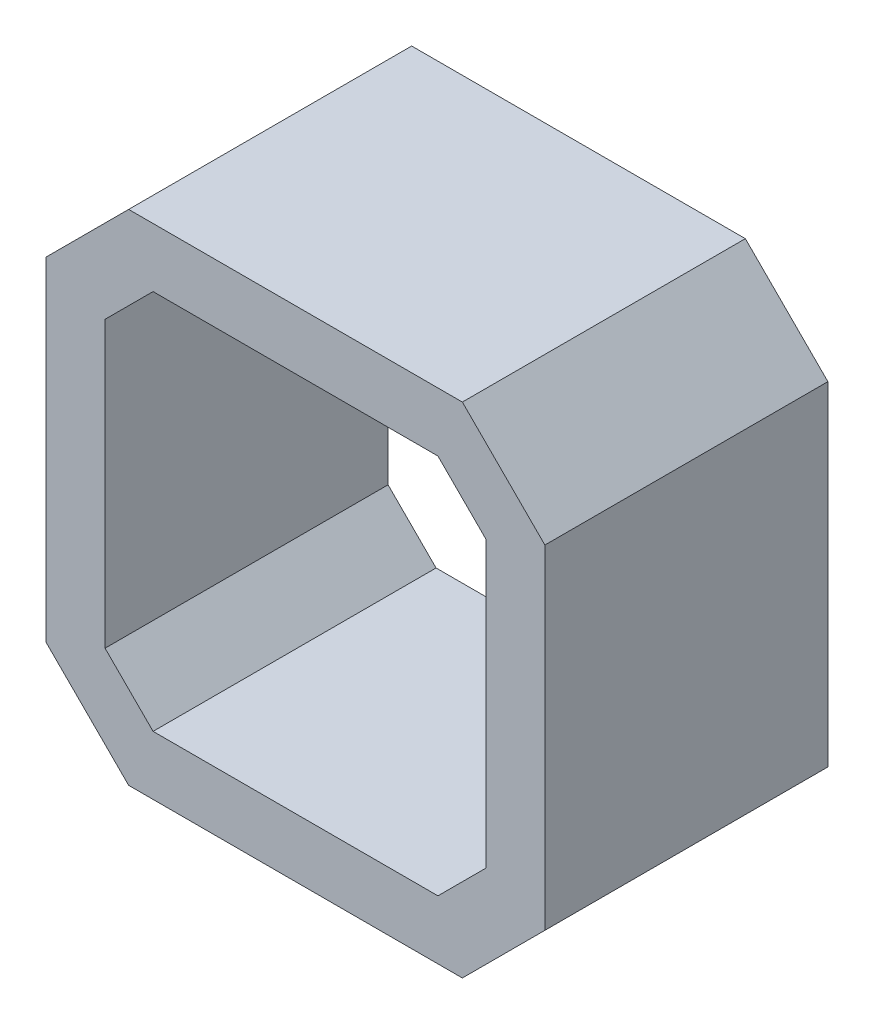
ISO-10303-21;
HEADER;
FILE_DESCRIPTION(('STEP AP214'),'2;1');
FILE_NAME('part.step','',(''),(''),'','','');
FILE_SCHEMA(('AUTOMOTIVE_DESIGN { 1 0 10303 214 1 1 1 1 }'));
ENDSEC;
DATA;
#1=APPLICATION_CONTEXT('core data for automotive mechanical design processes');
#2=APPLICATION_PROTOCOL_DEFINITION('international standard','automotive_design',2000,#1);
#3=PRODUCT_CONTEXT('',#1,'mechanical');
#4=PRODUCT('Part','Part','',(#3));
#5=PRODUCT_RELATED_PRODUCT_CATEGORY('part','',(#4));
#6=PRODUCT_DEFINITION_FORMATION('','',#4);
#7=PRODUCT_DEFINITION_CONTEXT('part definition',#1,'design');
#8=PRODUCT_DEFINITION('design','',#6,#7);
#9=PRODUCT_DEFINITION_SHAPE('','',#8);
#10=(LENGTH_UNIT() NAMED_UNIT(*) SI_UNIT(.MILLI.,.METRE.));
#11=(NAMED_UNIT(*) PLANE_ANGLE_UNIT() SI_UNIT($,.RADIAN.));
#12=(NAMED_UNIT(*) SI_UNIT($,.STERADIAN.) SOLID_ANGLE_UNIT());
#13=UNCERTAINTY_MEASURE_WITH_UNIT(LENGTH_MEASURE(1.E-05),#10,'distance_accuracy_value','');
#14=(GEOMETRIC_REPRESENTATION_CONTEXT(3) GLOBAL_UNCERTAINTY_ASSIGNED_CONTEXT((#13)) GLOBAL_UNIT_ASSIGNED_CONTEXT((#10,
#11,#12)) REPRESENTATION_CONTEXT('',''));
#15=CARTESIAN_POINT('',(0.,0.,0.));
#16=DIRECTION('',(0.,0.,1.));
#17=DIRECTION('',(1.,0.,0.));
#18=AXIS2_PLACEMENT_3D('',#15,#16,#17);
#19=CARTESIAN_POINT('',(0.,0.,84.));
#20=DIRECTION('',(0.,0.,-1.));
#21=DIRECTION('',(-1.,0.,0.));
#22=AXIS2_PLACEMENT_3D('',#19,#20,#21);
#23=PLANE('',#22);
#24=DIRECTION('',(0.,-1.,0.));
#25=VECTOR('',#24,1.);
#26=CARTESIAN_POINT('',(-74.0249999999999,-49.525,84.));
#27=LINE('',#26,#25);
#28=CARTESIAN_POINT('',(-74.0249999999999,49.525,84.));
#29=VERTEX_POINT('',#28);
#30=CARTESIAN_POINT('',(-74.0249999999999,-49.525,84.));
#31=VERTEX_POINT('',#30);
#32=EDGE_CURVE('E241',#29,#31,#27,.T.);
#33=ORIENTED_EDGE('',*,*,#32,.T.);
#34=DIRECTION('',(0.707106781186547,-0.707106781186547,0.));
#35=VECTOR('',#34,1.);
#36=CARTESIAN_POINT('',(-74.0249999999999,-49.525,84.));
#37=LINE('',#36,#35);
#38=CARTESIAN_POINT('',(-49.5249999999999,-74.025,84.));
#39=VERTEX_POINT('',#38);
#40=EDGE_CURVE('E245',#31,#39,#37,.T.);
#41=ORIENTED_EDGE('',*,*,#40,.T.);
#42=DIRECTION('',(1.,0.,0.));
#43=VECTOR('',#42,1.);
#44=CARTESIAN_POINT('',(-49.5249999999999,-74.025,84.));
#45=LINE('',#44,#43);
#46=CARTESIAN_POINT('',(49.5250000000001,-74.025,84.));
#47=VERTEX_POINT('',#46);
#48=EDGE_CURVE('E249',#39,#47,#45,.T.);
#49=ORIENTED_EDGE('',*,*,#48,.T.);
#50=DIRECTION('',(0.707106781186547,0.707106781186547,0.));
#51=VECTOR('',#50,1.);
#52=CARTESIAN_POINT('',(49.5250000000001,-74.025,84.));
#53=LINE('',#52,#51);
#54=CARTESIAN_POINT('',(74.0250000000001,-49.525,84.));
#55=VERTEX_POINT('',#54);
#56=EDGE_CURVE('E252',#47,#55,#53,.T.);
#57=ORIENTED_EDGE('',*,*,#56,.T.);
#58=DIRECTION('',(0.,1.,0.));
#59=VECTOR('',#58,1.);
#60=CARTESIAN_POINT('',(74.0250000000001,-49.525,84.));
#61=LINE('',#60,#59);
#62=CARTESIAN_POINT('',(74.0250000000001,49.525,84.));
#63=VERTEX_POINT('',#62);
#64=EDGE_CURVE('E255',#55,#63,#61,.T.);
#65=ORIENTED_EDGE('',*,*,#64,.T.);
#66=DIRECTION('',(-0.707106781186547,0.707106781186547,0.));
#67=VECTOR('',#66,1.);
#68=CARTESIAN_POINT('',(49.5250000000001,74.025,84.));
#69=LINE('',#68,#67);
#70=CARTESIAN_POINT('',(49.5250000000001,74.025,84.));
#71=VERTEX_POINT('',#70);
#72=EDGE_CURVE('E258',#63,#71,#69,.T.);
#73=ORIENTED_EDGE('',*,*,#72,.T.);
#74=DIRECTION('',(-1.,0.,0.));
#75=VECTOR('',#74,1.);
#76=CARTESIAN_POINT('',(-49.5249999999999,74.025,84.));
#77=LINE('',#76,#75);
#78=CARTESIAN_POINT('',(-49.5249999999999,74.025,84.));
#79=VERTEX_POINT('',#78);
#80=EDGE_CURVE('E261',#71,#79,#77,.T.);
#81=ORIENTED_EDGE('',*,*,#80,.T.);
#82=DIRECTION('',(-0.707106781186547,-0.707106781186547,0.));
#83=VECTOR('',#82,1.);
#84=CARTESIAN_POINT('',(-74.0249999999999,49.525,84.));
#85=LINE('',#84,#83);
#86=EDGE_CURVE('E264',#79,#29,#85,.T.);
#87=ORIENTED_EDGE('',*,*,#86,.T.);
#88=EDGE_LOOP('',(#33,#41,#49,#57,#65,#73,#81,#87));
#89=FACE_BOUND('',#88,.T.);
#90=DIRECTION('',(-0.707106781186547,-0.707106781186547,0.));
#91=VECTOR('',#90,1.);
#92=CARTESIAN_POINT('',(-56.5249999999999,42.2762626584708,84.));
#93=LINE('',#92,#91);
#94=CARTESIAN_POINT('',(-42.2762626584707,56.525,84.));
#95=VERTEX_POINT('',#94);
#96=CARTESIAN_POINT('',(-56.5249999999999,42.2762626584708,84.));
#97=VERTEX_POINT('',#96);
#98=EDGE_CURVE('E152',#95,#97,#93,.T.);
#99=ORIENTED_EDGE('',*,*,#98,.F.);
#100=DIRECTION('',(-1.,0.,0.));
#101=VECTOR('',#100,1.);
#102=CARTESIAN_POINT('',(-42.2762626584707,56.525,84.));
#103=LINE('',#102,#101);
#104=CARTESIAN_POINT('',(42.2762626584709,56.525,84.));
#105=VERTEX_POINT('',#104);
#106=EDGE_CURVE('E193',#105,#95,#103,.T.);
#107=ORIENTED_EDGE('',*,*,#106,.F.);
#108=DIRECTION('',(-0.707106781186547,0.707106781186547,0.));
#109=VECTOR('',#108,1.);
#110=CARTESIAN_POINT('',(42.2762626584709,56.525,84.));
#111=LINE('',#110,#109);
#112=CARTESIAN_POINT('',(56.5250000000001,42.2762626584708,84.));
#113=VERTEX_POINT('',#112);
#114=EDGE_CURVE('E190',#113,#105,#111,.T.);
#115=ORIENTED_EDGE('',*,*,#114,.F.);
#116=DIRECTION('',(0.,1.,0.));
#117=VECTOR('',#116,1.);
#118=CARTESIAN_POINT('',(56.5250000000001,-42.2762626584708,84.));
#119=LINE('',#118,#117);
#120=CARTESIAN_POINT('',(56.5250000000001,-42.2762626584708,84.));
#121=VERTEX_POINT('',#120);
#122=EDGE_CURVE('E187',#121,#113,#119,.T.);
#123=ORIENTED_EDGE('',*,*,#122,.F.);
#124=DIRECTION('',(0.707106781186547,0.707106781186547,0.));
#125=VECTOR('',#124,1.);
#126=CARTESIAN_POINT('',(42.2762626584709,-56.525,84.));
#127=LINE('',#126,#125);
#128=CARTESIAN_POINT('',(42.2762626584709,-56.525,84.));
#129=VERTEX_POINT('',#128);
#130=EDGE_CURVE('E184',#129,#121,#127,.T.);
#131=ORIENTED_EDGE('',*,*,#130,.F.);
#132=DIRECTION('',(1.,0.,0.));
#133=VECTOR('',#132,1.);
#134=CARTESIAN_POINT('',(-42.2762626584707,-56.525,84.));
#135=LINE('',#134,#133);
#136=CARTESIAN_POINT('',(-42.2762626584707,-56.525,84.));
#137=VERTEX_POINT('',#136);
#138=EDGE_CURVE('E179',#137,#129,#135,.T.);
#139=ORIENTED_EDGE('',*,*,#138,.F.);
#140=DIRECTION('',(0.707106781186547,-0.707106781186547,0.));
#141=VECTOR('',#140,1.);
#142=CARTESIAN_POINT('',(-56.5249999999999,-42.2762626584708,84.));
#143=LINE('',#142,#141);
#144=CARTESIAN_POINT('',(-56.5249999999999,-42.2762626584708,84.));
#145=VERTEX_POINT('',#144);
#146=EDGE_CURVE('E175',#145,#137,#143,.T.);
#147=ORIENTED_EDGE('',*,*,#146,.F.);
#148=DIRECTION('',(0.,-1.,0.));
#149=VECTOR('',#148,1.);
#150=CARTESIAN_POINT('',(-56.5249999999999,-42.2762626584708,84.));
#151=LINE('',#150,#149);
#152=EDGE_CURVE('E161',#97,#145,#151,.T.);
#153=ORIENTED_EDGE('',*,*,#152,.F.);
#154=EDGE_LOOP('',(#99,#107,#115,#123,#131,#139,#147,#153));
#155=FACE_BOUND('',#154,.T.);
#156=ADVANCED_FACE('F38',(#89,#155),#23,.F.);
#157=CARTESIAN_POINT('',(0.,0.,0.));
#158=DIRECTION('',(0.,0.,-1.));
#159=DIRECTION('',(-1.,0.,0.));
#160=AXIS2_PLACEMENT_3D('',#157,#158,#159);
#161=PLANE('',#160);
#162=DIRECTION('',(0.,-1.,0.));
#163=VECTOR('',#162,1.);
#164=CARTESIAN_POINT('',(-74.0249999999999,-49.525,0.));
#165=LINE('',#164,#163);
#166=CARTESIAN_POINT('',(-74.0249999999999,49.525,0.));
#167=VERTEX_POINT('',#166);
#168=CARTESIAN_POINT('',(-74.0249999999999,-49.525,0.));
#169=VERTEX_POINT('',#168);
#170=EDGE_CURVE('E170',#167,#169,#165,.T.);
#171=ORIENTED_EDGE('',*,*,#170,.F.);
#172=DIRECTION('',(-0.707106781186547,-0.707106781186547,0.));
#173=VECTOR('',#172,1.);
#174=CARTESIAN_POINT('',(-74.0249999999999,49.525,0.));
#175=LINE('',#174,#173);
#176=CARTESIAN_POINT('',(-49.5249999999999,74.025,0.));
#177=VERTEX_POINT('',#176);
#178=EDGE_CURVE('E246',#177,#167,#175,.T.);
#179=ORIENTED_EDGE('',*,*,#178,.F.);
#180=DIRECTION('',(-1.,0.,0.));
#181=VECTOR('',#180,1.);
#182=CARTESIAN_POINT('',(-49.5249999999999,74.025,0.));
#183=LINE('',#182,#181);
#184=CARTESIAN_POINT('',(49.5250000000001,74.025,0.));
#185=VERTEX_POINT('',#184);
#186=EDGE_CURVE('E286',#185,#177,#183,.T.);
#187=ORIENTED_EDGE('',*,*,#186,.F.);
#188=DIRECTION('',(-0.707106781186547,0.707106781186547,0.));
#189=VECTOR('',#188,1.);
#190=CARTESIAN_POINT('',(49.5250000000001,74.025,0.));
#191=LINE('',#190,#189);
#192=CARTESIAN_POINT('',(74.0250000000001,49.525,0.));
#193=VERTEX_POINT('',#192);
#194=EDGE_CURVE('E283',#193,#185,#191,.T.);
#195=ORIENTED_EDGE('',*,*,#194,.F.);
#196=DIRECTION('',(0.,1.,0.));
#197=VECTOR('',#196,1.);
#198=CARTESIAN_POINT('',(74.0250000000001,-49.525,0.));
#199=LINE('',#198,#197);
#200=CARTESIAN_POINT('',(74.0250000000001,-49.525,0.));
#201=VERTEX_POINT('',#200);
#202=EDGE_CURVE('E280',#201,#193,#199,.T.);
#203=ORIENTED_EDGE('',*,*,#202,.F.);
#204=DIRECTION('',(0.707106781186547,0.707106781186547,0.));
#205=VECTOR('',#204,1.);
#206=CARTESIAN_POINT('',(49.5250000000001,-74.025,0.));
#207=LINE('',#206,#205);
#208=CARTESIAN_POINT('',(49.5250000000001,-74.025,0.));
#209=VERTEX_POINT('',#208);
#210=EDGE_CURVE('E277',#209,#201,#207,.T.);
#211=ORIENTED_EDGE('',*,*,#210,.F.);
#212=DIRECTION('',(1.,0.,0.));
#213=VECTOR('',#212,1.);
#214=CARTESIAN_POINT('',(-49.5249999999999,-74.025,0.));
#215=LINE('',#214,#213);
#216=CARTESIAN_POINT('',(-49.5249999999999,-74.025,0.));
#217=VERTEX_POINT('',#216);
#218=EDGE_CURVE('E274',#217,#209,#215,.T.);
#219=ORIENTED_EDGE('',*,*,#218,.F.);
#220=DIRECTION('',(0.707106781186547,-0.707106781186547,0.));
#221=VECTOR('',#220,1.);
#222=CARTESIAN_POINT('',(-74.0249999999999,-49.525,0.));
#223=LINE('',#222,#221);
#224=EDGE_CURVE('E271',#169,#217,#223,.T.);
#225=ORIENTED_EDGE('',*,*,#224,.F.);
#226=EDGE_LOOP('',(#171,#179,#187,#195,#203,#211,#219,#225));
#227=FACE_BOUND('',#226,.T.);
#228=DIRECTION('',(-1.,0.,0.));
#229=VECTOR('',#228,1.);
#230=CARTESIAN_POINT('',(-42.2762626584707,56.525,0.));
#231=LINE('',#230,#229);
#232=CARTESIAN_POINT('',(42.2762626584709,56.525,0.));
#233=VERTEX_POINT('',#232);
#234=CARTESIAN_POINT('',(-42.2762626584707,56.525,0.));
#235=VERTEX_POINT('',#234);
#236=EDGE_CURVE('E162',#233,#235,#231,.T.);
#237=ORIENTED_EDGE('',*,*,#236,.T.);
#238=DIRECTION('',(-0.707106781186547,-0.707106781186547,0.));
#239=VECTOR('',#238,1.);
#240=CARTESIAN_POINT('',(-56.5249999999999,42.2762626584708,0.));
#241=LINE('',#240,#239);
#242=CARTESIAN_POINT('',(-56.5249999999999,42.2762626584708,0.));
#243=VERTEX_POINT('',#242);
#244=EDGE_CURVE('E62',#235,#243,#241,.T.);
#245=ORIENTED_EDGE('',*,*,#244,.T.);
#246=DIRECTION('',(0.,-1.,0.));
#247=VECTOR('',#246,1.);
#248=CARTESIAN_POINT('',(-56.5249999999999,-42.2762626584708,0.));
#249=LINE('',#248,#247);
#250=CARTESIAN_POINT('',(-56.5249999999999,-42.2762626584708,0.));
#251=VERTEX_POINT('',#250);
#252=EDGE_CURVE('E168',#243,#251,#249,.T.);
#253=ORIENTED_EDGE('',*,*,#252,.T.);
#254=DIRECTION('',(0.707106781186547,-0.707106781186547,0.));
#255=VECTOR('',#254,1.);
#256=CARTESIAN_POINT('',(-56.5249999999999,-42.2762626584708,0.));
#257=LINE('',#256,#255);
#258=CARTESIAN_POINT('',(-42.2762626584707,-56.525,0.));
#259=VERTEX_POINT('',#258);
#260=EDGE_CURVE('E200',#251,#259,#257,.T.);
#261=ORIENTED_EDGE('',*,*,#260,.T.);
#262=DIRECTION('',(1.,0.,0.));
#263=VECTOR('',#262,1.);
#264=CARTESIAN_POINT('',(-42.2762626584707,-56.525,0.));
#265=LINE('',#264,#263);
#266=CARTESIAN_POINT('',(42.2762626584709,-56.525,0.));
#267=VERTEX_POINT('',#266);
#268=EDGE_CURVE('E204',#259,#267,#265,.T.);
#269=ORIENTED_EDGE('',*,*,#268,.T.);
#270=DIRECTION('',(0.707106781186547,0.707106781186547,0.));
#271=VECTOR('',#270,1.);
#272=CARTESIAN_POINT('',(42.2762626584709,-56.525,0.));
#273=LINE('',#272,#271);
#274=CARTESIAN_POINT('',(56.5250000000001,-42.2762626584708,0.));
#275=VERTEX_POINT('',#274);
#276=EDGE_CURVE('E208',#267,#275,#273,.T.);
#277=ORIENTED_EDGE('',*,*,#276,.T.);
#278=DIRECTION('',(0.,1.,0.));
#279=VECTOR('',#278,1.);
#280=CARTESIAN_POINT('',(56.5250000000001,-42.2762626584708,0.));
#281=LINE('',#280,#279);
#282=CARTESIAN_POINT('',(56.5250000000001,42.2762626584708,0.));
#283=VERTEX_POINT('',#282);
#284=EDGE_CURVE('E212',#275,#283,#281,.T.);
#285=ORIENTED_EDGE('',*,*,#284,.T.);
#286=DIRECTION('',(-0.707106781186547,0.707106781186547,0.));
#287=VECTOR('',#286,1.);
#288=CARTESIAN_POINT('',(42.2762626584709,56.525,0.));
#289=LINE('',#288,#287);
#290=EDGE_CURVE('E216',#283,#233,#289,.T.);
#291=ORIENTED_EDGE('',*,*,#290,.T.);
#292=EDGE_LOOP('',(#237,#245,#253,#261,#269,#277,#285,#291));
#293=FACE_BOUND('',#292,.T.);
#294=ADVANCED_FACE('F325',(#227,#293),#161,.T.);
#295=CARTESIAN_POINT('',(-74.0249999999999,-49.525,84.));
#296=DIRECTION('',(1.,0.,0.));
#297=DIRECTION('',(0.,0.,-1.));
#298=AXIS2_PLACEMENT_3D('',#295,#296,#297);
#299=PLANE('',#298);
#300=ORIENTED_EDGE('',*,*,#170,.T.);
#301=DIRECTION('',(0.,0.,-1.));
#302=VECTOR('',#301,1.);
#303=CARTESIAN_POINT('',(-74.0249999999999,-49.525,84.));
#304=LINE('',#303,#302);
#305=EDGE_CURVE('E11',#31,#169,#304,.T.);
#306=ORIENTED_EDGE('',*,*,#305,.F.);
#307=ORIENTED_EDGE('',*,*,#32,.F.);
#308=DIRECTION('',(0.,0.,-1.));
#309=VECTOR('',#308,1.);
#310=CARTESIAN_POINT('',(-74.0249999999999,49.525,84.));
#311=LINE('',#310,#309);
#312=EDGE_CURVE('E267',#29,#167,#311,.T.);
#313=ORIENTED_EDGE('',*,*,#312,.T.);
#314=EDGE_LOOP('',(#300,#306,#307,#313));
#315=FACE_BOUND('',#314,.T.);
#316=ADVANCED_FACE('F40',(#315),#299,.F.);
#317=CARTESIAN_POINT('',(-74.0249999999999,-49.525,84.));
#318=DIRECTION('',(0.707106781186548,0.707106781186548,0.));
#319=DIRECTION('',(-0.707106781186548,0.707106781186548,0.));
#320=AXIS2_PLACEMENT_3D('',#317,#318,#319);
#321=PLANE('',#320);
#322=ORIENTED_EDGE('',*,*,#224,.T.);
#323=DIRECTION('',(0.,0.,-1.));
#324=VECTOR('',#323,1.);
#325=CARTESIAN_POINT('',(-49.5249999999999,-74.025,84.));
#326=LINE('',#325,#324);
#327=EDGE_CURVE('E47',#39,#217,#326,.T.);
#328=ORIENTED_EDGE('',*,*,#327,.F.);
#329=ORIENTED_EDGE('',*,*,#40,.F.);
#330=ORIENTED_EDGE('',*,*,#305,.T.);
#331=EDGE_LOOP('',(#322,#328,#329,#330));
#332=FACE_BOUND('',#331,.T.);
#333=ADVANCED_FACE('F342',(#332),#321,.F.);
#334=CARTESIAN_POINT('',(-49.5249999999999,-74.025,84.));
#335=DIRECTION('',(0.,1.,0.));
#336=DIRECTION('',(0.,0.,1.));
#337=AXIS2_PLACEMENT_3D('',#334,#335,#336);
#338=PLANE('',#337);
#339=ORIENTED_EDGE('',*,*,#218,.T.);
#340=DIRECTION('',(0.,0.,-1.));
#341=VECTOR('',#340,1.);
#342=CARTESIAN_POINT('',(49.5250000000001,-74.025,84.));
#343=LINE('',#342,#341);
#344=EDGE_CURVE('E310',#47,#209,#343,.T.);
#345=ORIENTED_EDGE('',*,*,#344,.F.);
#346=ORIENTED_EDGE('',*,*,#48,.F.);
#347=ORIENTED_EDGE('',*,*,#327,.T.);
#348=EDGE_LOOP('',(#339,#345,#346,#347));
#349=FACE_BOUND('',#348,.T.);
#350=ADVANCED_FACE('F319',(#349),#338,.F.);
#351=CARTESIAN_POINT('',(49.5250000000001,-74.025,84.));
#352=DIRECTION('',(-0.707106781186548,0.707106781186548,0.));
#353=DIRECTION('',(-0.707106781186548,-0.707106781186548,0.));
#354=AXIS2_PLACEMENT_3D('',#351,#352,#353);
#355=PLANE('',#354);
#356=ORIENTED_EDGE('',*,*,#210,.T.);
#357=DIRECTION('',(0.,0.,-1.));
#358=VECTOR('',#357,1.);
#359=CARTESIAN_POINT('',(74.0250000000001,-49.525,84.));
#360=LINE('',#359,#358);
#361=EDGE_CURVE('E306',#55,#201,#360,.T.);
#362=ORIENTED_EDGE('',*,*,#361,.F.);
#363=ORIENTED_EDGE('',*,*,#56,.F.);
#364=ORIENTED_EDGE('',*,*,#344,.T.);
#365=EDGE_LOOP('',(#356,#362,#363,#364));
#366=FACE_BOUND('',#365,.T.);
#367=ADVANCED_FACE('F331',(#366),#355,.F.);
#368=CARTESIAN_POINT('',(74.0250000000001,-49.525,84.));
#369=DIRECTION('',(-1.,0.,0.));
#370=DIRECTION('',(0.,0.,1.));
#371=AXIS2_PLACEMENT_3D('',#368,#369,#370);
#372=PLANE('',#371);
#373=ORIENTED_EDGE('',*,*,#202,.T.);
#374=DIRECTION('',(0.,0.,-1.));
#375=VECTOR('',#374,1.);
#376=CARTESIAN_POINT('',(74.0250000000001,49.525,84.));
#377=LINE('',#376,#375);
#378=EDGE_CURVE('E302',#63,#193,#377,.T.);
#379=ORIENTED_EDGE('',*,*,#378,.F.);
#380=ORIENTED_EDGE('',*,*,#64,.F.);
#381=ORIENTED_EDGE('',*,*,#361,.T.);
#382=EDGE_LOOP('',(#373,#379,#380,#381));
#383=FACE_BOUND('',#382,.T.);
#384=ADVANCED_FACE('F335',(#383),#372,.F.);
#385=CARTESIAN_POINT('',(49.5250000000001,74.025,84.));
#386=DIRECTION('',(-0.707106781186548,-0.707106781186548,0.));
#387=DIRECTION('',(0.707106781186548,-0.707106781186548,0.));
#388=AXIS2_PLACEMENT_3D('',#385,#386,#387);
#389=PLANE('',#388);
#390=ORIENTED_EDGE('',*,*,#194,.T.);
#391=DIRECTION('',(0.,0.,-1.));
#392=VECTOR('',#391,1.);
#393=CARTESIAN_POINT('',(49.5250000000001,74.025,84.));
#394=LINE('',#393,#392);
#395=EDGE_CURVE('E298',#71,#185,#394,.T.);
#396=ORIENTED_EDGE('',*,*,#395,.F.);
#397=ORIENTED_EDGE('',*,*,#72,.F.);
#398=ORIENTED_EDGE('',*,*,#378,.T.);
#399=EDGE_LOOP('',(#390,#396,#397,#398));
#400=FACE_BOUND('',#399,.T.);
#401=ADVANCED_FACE('F355',(#400),#389,.F.);
#402=CARTESIAN_POINT('',(-49.5249999999999,74.025,84.));
#403=DIRECTION('',(0.,-1.,0.));
#404=DIRECTION('',(0.,0.,-1.));
#405=AXIS2_PLACEMENT_3D('',#402,#403,#404);
#406=PLANE('',#405);
#407=ORIENTED_EDGE('',*,*,#186,.T.);
#408=DIRECTION('',(0.,0.,-1.));
#409=VECTOR('',#408,1.);
#410=CARTESIAN_POINT('',(-49.5249999999999,74.025,84.));
#411=LINE('',#410,#409);
#412=EDGE_CURVE('E294',#79,#177,#411,.T.);
#413=ORIENTED_EDGE('',*,*,#412,.F.);
#414=ORIENTED_EDGE('',*,*,#80,.F.);
#415=ORIENTED_EDGE('',*,*,#395,.T.);
#416=EDGE_LOOP('',(#407,#413,#414,#415));
#417=FACE_BOUND('',#416,.T.);
#418=ADVANCED_FACE('F353',(#417),#406,.F.);
#419=CARTESIAN_POINT('',(-74.0249999999999,49.525,84.));
#420=DIRECTION('',(0.707106781186548,-0.707106781186548,0.));
#421=DIRECTION('',(0.707106781186548,0.707106781186548,0.));
#422=AXIS2_PLACEMENT_3D('',#419,#420,#421);
#423=PLANE('',#422);
#424=ORIENTED_EDGE('',*,*,#178,.T.);
#425=ORIENTED_EDGE('',*,*,#312,.F.);
#426=ORIENTED_EDGE('',*,*,#86,.F.);
#427=ORIENTED_EDGE('',*,*,#412,.T.);
#428=EDGE_LOOP('',(#424,#425,#426,#427));
#429=FACE_BOUND('',#428,.T.);
#430=ADVANCED_FACE('F348',(#429),#423,.F.);
#431=CARTESIAN_POINT('',(-56.5249999999999,42.2762626584708,84.));
#432=DIRECTION('',(0.707106781186548,-0.707106781186548,0.));
#433=DIRECTION('',(0.707106781186548,0.707106781186548,0.));
#434=AXIS2_PLACEMENT_3D('',#431,#432,#433);
#435=PLANE('',#434);
#436=ORIENTED_EDGE('',*,*,#244,.F.);
#437=DIRECTION('',(0.,0.,-1.));
#438=VECTOR('',#437,1.);
#439=CARTESIAN_POINT('',(-42.2762626584707,56.525,84.));
#440=LINE('',#439,#438);
#441=EDGE_CURVE('E156',#95,#235,#440,.T.);
#442=ORIENTED_EDGE('',*,*,#441,.F.);
#443=ORIENTED_EDGE('',*,*,#98,.T.);
#444=DIRECTION('',(0.,0.,-1.));
#445=VECTOR('',#444,1.);
#446=CARTESIAN_POINT('',(-56.5249999999999,42.2762626584708,84.));
#447=LINE('',#446,#445);
#448=EDGE_CURVE('E155',#97,#243,#447,.T.);
#449=ORIENTED_EDGE('',*,*,#448,.T.);
#450=EDGE_LOOP('',(#436,#442,#443,#449));
#451=FACE_BOUND('',#450,.T.);
#452=ADVANCED_FACE('F154',(#451),#435,.T.);
#453=CARTESIAN_POINT('',(-56.5249999999999,-42.2762626584708,84.));
#454=DIRECTION('',(1.,0.,0.));
#455=DIRECTION('',(0.,0.,-1.));
#456=AXIS2_PLACEMENT_3D('',#453,#454,#455);
#457=PLANE('',#456);
#458=ORIENTED_EDGE('',*,*,#252,.F.);
#459=ORIENTED_EDGE('',*,*,#448,.F.);
#460=ORIENTED_EDGE('',*,*,#152,.T.);
#461=DIRECTION('',(0.,0.,-1.));
#462=VECTOR('',#461,1.);
#463=CARTESIAN_POINT('',(-56.5249999999999,-42.2762626584708,84.));
#464=LINE('',#463,#462);
#465=EDGE_CURVE('E171',#145,#251,#464,.T.);
#466=ORIENTED_EDGE('',*,*,#465,.T.);
#467=EDGE_LOOP('',(#458,#459,#460,#466));
#468=FACE_BOUND('',#467,.T.);
#469=ADVANCED_FACE('F165',(#468),#457,.T.);
#470=CARTESIAN_POINT('',(-56.5249999999999,-42.2762626584708,84.));
#471=DIRECTION('',(0.707106781186548,0.707106781186548,0.));
#472=DIRECTION('',(-0.707106781186548,0.707106781186548,0.));
#473=AXIS2_PLACEMENT_3D('',#470,#471,#472);
#474=PLANE('',#473);
#475=ORIENTED_EDGE('',*,*,#260,.F.);
#476=ORIENTED_EDGE('',*,*,#465,.F.);
#477=ORIENTED_EDGE('',*,*,#146,.T.);
#478=DIRECTION('',(0.,0.,-1.));
#479=VECTOR('',#478,1.);
#480=CARTESIAN_POINT('',(-42.2762626584707,-56.525,84.));
#481=LINE('',#480,#479);
#482=EDGE_CURVE('E236',#137,#259,#481,.T.);
#483=ORIENTED_EDGE('',*,*,#482,.T.);
#484=EDGE_LOOP('',(#475,#476,#477,#483));
#485=FACE_BOUND('',#484,.T.);
#486=ADVANCED_FACE('F380',(#485),#474,.T.);
#487=CARTESIAN_POINT('',(-42.2762626584707,-56.525,84.));
#488=DIRECTION('',(0.,1.,0.));
#489=DIRECTION('',(0.,0.,1.));
#490=AXIS2_PLACEMENT_3D('',#487,#488,#489);
#491=PLANE('',#490);
#492=ORIENTED_EDGE('',*,*,#268,.F.);
#493=ORIENTED_EDGE('',*,*,#482,.F.);
#494=ORIENTED_EDGE('',*,*,#138,.T.);
#495=DIRECTION('',(0.,0.,-1.));
#496=VECTOR('',#495,1.);
#497=CARTESIAN_POINT('',(42.2762626584709,-56.525,84.));
#498=LINE('',#497,#496);
#499=EDGE_CURVE('E233',#129,#267,#498,.T.);
#500=ORIENTED_EDGE('',*,*,#499,.T.);
#501=EDGE_LOOP('',(#492,#493,#494,#500));
#502=FACE_BOUND('',#501,.T.);
#503=ADVANCED_FACE('F384',(#502),#491,.T.);
#504=CARTESIAN_POINT('',(42.2762626584709,-56.525,84.));
#505=DIRECTION('',(-0.707106781186548,0.707106781186548,0.));
#506=DIRECTION('',(-0.707106781186548,-0.707106781186548,0.));
#507=AXIS2_PLACEMENT_3D('',#504,#505,#506);
#508=PLANE('',#507);
#509=ORIENTED_EDGE('',*,*,#276,.F.);
#510=ORIENTED_EDGE('',*,*,#499,.F.);
#511=ORIENTED_EDGE('',*,*,#130,.T.);
#512=DIRECTION('',(0.,0.,-1.));
#513=VECTOR('',#512,1.);
#514=CARTESIAN_POINT('',(56.5250000000001,-42.2762626584708,84.));
#515=LINE('',#514,#513);
#516=EDGE_CURVE('E230',#121,#275,#515,.T.);
#517=ORIENTED_EDGE('',*,*,#516,.T.);
#518=EDGE_LOOP('',(#509,#510,#511,#517));
#519=FACE_BOUND('',#518,.T.);
#520=ADVANCED_FACE('F390',(#519),#508,.T.);
#521=CARTESIAN_POINT('',(56.5250000000001,-42.2762626584708,84.));
#522=DIRECTION('',(-1.,0.,0.));
#523=DIRECTION('',(0.,0.,1.));
#524=AXIS2_PLACEMENT_3D('',#521,#522,#523);
#525=PLANE('',#524);
#526=ORIENTED_EDGE('',*,*,#284,.F.);
#527=ORIENTED_EDGE('',*,*,#516,.F.);
#528=ORIENTED_EDGE('',*,*,#122,.T.);
#529=DIRECTION('',(0.,0.,-1.));
#530=VECTOR('',#529,1.);
#531=CARTESIAN_POINT('',(56.5250000000001,42.2762626584708,84.));
#532=LINE('',#531,#530);
#533=EDGE_CURVE('E227',#113,#283,#532,.T.);
#534=ORIENTED_EDGE('',*,*,#533,.T.);
#535=EDGE_LOOP('',(#526,#527,#528,#534));
#536=FACE_BOUND('',#535,.T.);
#537=ADVANCED_FACE('F394',(#536),#525,.T.);
#538=CARTESIAN_POINT('',(42.2762626584709,56.525,84.));
#539=DIRECTION('',(-0.707106781186548,-0.707106781186548,0.));
#540=DIRECTION('',(0.707106781186548,-0.707106781186548,0.));
#541=AXIS2_PLACEMENT_3D('',#538,#539,#540);
#542=PLANE('',#541);
#543=ORIENTED_EDGE('',*,*,#290,.F.);
#544=ORIENTED_EDGE('',*,*,#533,.F.);
#545=ORIENTED_EDGE('',*,*,#114,.T.);
#546=DIRECTION('',(0.,0.,-1.));
#547=VECTOR('',#546,1.);
#548=CARTESIAN_POINT('',(42.2762626584709,56.525,84.));
#549=LINE('',#548,#547);
#550=EDGE_CURVE('E54',#105,#233,#549,.T.);
#551=ORIENTED_EDGE('',*,*,#550,.T.);
#552=EDGE_LOOP('',(#543,#544,#545,#551));
#553=FACE_BOUND('',#552,.T.);
#554=ADVANCED_FACE('F398',(#553),#542,.T.);
#555=CARTESIAN_POINT('',(-42.2762626584707,56.525,84.));
#556=DIRECTION('',(0.,-1.,0.));
#557=DIRECTION('',(0.,0.,-1.));
#558=AXIS2_PLACEMENT_3D('',#555,#556,#557);
#559=PLANE('',#558);
#560=ORIENTED_EDGE('',*,*,#236,.F.);
#561=ORIENTED_EDGE('',*,*,#550,.F.);
#562=ORIENTED_EDGE('',*,*,#106,.T.);
#563=ORIENTED_EDGE('',*,*,#441,.T.);
#564=EDGE_LOOP('',(#560,#561,#562,#563));
#565=FACE_BOUND('',#564,.T.);
#566=ADVANCED_FACE('F402',(#565),#559,.T.);
#567=CLOSED_SHELL('',(#156,#294,#316,#333,#350,#367,#384,#401,#418,#430,#452,#469,#486,#503,
#520,#537,#554,#566));
#568=MANIFOLD_SOLID_BREP('B2',#567);
#569=ADVANCED_BREP_SHAPE_REPRESENTATION('',(#18,#568),#14);
#570=SHAPE_DEFINITION_REPRESENTATION(#9,#569);
ENDSEC;
END-ISO-10303-21;
